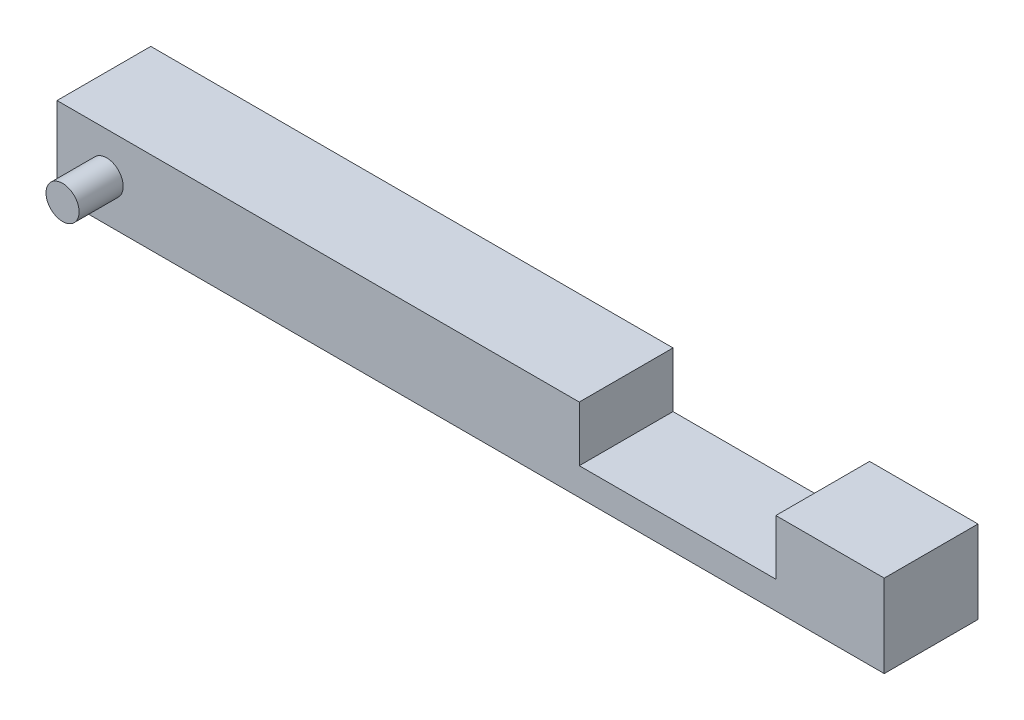
ISO-10303-21;
HEADER;
FILE_DESCRIPTION(('STEP AP214'),'2;1');
FILE_NAME('part.step','',(''),(''),'','','');
FILE_SCHEMA(('AUTOMOTIVE_DESIGN { 1 0 10303 214 1 1 1 1 }'));
ENDSEC;
DATA;
#1=APPLICATION_CONTEXT('core data for automotive mechanical design processes');
#2=APPLICATION_PROTOCOL_DEFINITION('international standard','automotive_design',2000,#1);
#3=PRODUCT_CONTEXT('',#1,'mechanical');
#4=PRODUCT('Part','Part','',(#3));
#5=PRODUCT_RELATED_PRODUCT_CATEGORY('part','',(#4));
#6=PRODUCT_DEFINITION_FORMATION('','',#4);
#7=PRODUCT_DEFINITION_CONTEXT('part definition',#1,'design');
#8=PRODUCT_DEFINITION('design','',#6,#7);
#9=PRODUCT_DEFINITION_SHAPE('','',#8);
#10=(LENGTH_UNIT() NAMED_UNIT(*) SI_UNIT(.MILLI.,.METRE.));
#11=(NAMED_UNIT(*) PLANE_ANGLE_UNIT() SI_UNIT($,.RADIAN.));
#12=(NAMED_UNIT(*) SI_UNIT($,.STERADIAN.) SOLID_ANGLE_UNIT());
#13=UNCERTAINTY_MEASURE_WITH_UNIT(LENGTH_MEASURE(1.E-05),#10,'distance_accuracy_value','');
#14=(GEOMETRIC_REPRESENTATION_CONTEXT(3) GLOBAL_UNCERTAINTY_ASSIGNED_CONTEXT((#13)) GLOBAL_UNIT_ASSIGNED_CONTEXT((#10,
#11,#12)) REPRESENTATION_CONTEXT('',''));
#15=CARTESIAN_POINT('',(0.,0.,0.));
#16=DIRECTION('',(0.,0.,1.));
#17=DIRECTION('',(1.,0.,0.));
#18=AXIS2_PLACEMENT_3D('',#15,#16,#17);
#19=CARTESIAN_POINT('',(-60.5906882591093,-20.3481781376518,17.));
#20=DIRECTION('',(1.,0.,0.));
#21=DIRECTION('',(0.,0.,-1.));
#22=AXIS2_PLACEMENT_3D('',#19,#20,#21);
#23=PLANE('',#22);
#24=DIRECTION('',(0.,-1.,0.));
#25=VECTOR('',#24,1.);
#26=CARTESIAN_POINT('',(-60.5906882591093,-20.3481781376518,0.));
#27=LINE('',#26,#25);
#28=CARTESIAN_POINT('',(-60.5906882591093,-5.34817813765183,0.));
#29=VERTEX_POINT('',#28);
#30=CARTESIAN_POINT('',(-60.5906882591093,-20.3481781376518,0.));
#31=VERTEX_POINT('',#30);
#32=EDGE_CURVE('E147',#29,#31,#27,.T.);
#33=ORIENTED_EDGE('',*,*,#32,.T.);
#34=DIRECTION('',(0.,0.,-1.));
#35=VECTOR('',#34,1.);
#36=CARTESIAN_POINT('',(-60.5906882591093,-20.3481781376518,17.));
#37=LINE('',#36,#35);
#38=CARTESIAN_POINT('',(-60.5906882591093,-20.3481781376518,17.));
#39=VERTEX_POINT('',#38);
#40=EDGE_CURVE('E54',#39,#31,#37,.T.);
#41=ORIENTED_EDGE('',*,*,#40,.F.);
#42=DIRECTION('',(0.,-1.,0.));
#43=VECTOR('',#42,1.);
#44=CARTESIAN_POINT('',(-60.5906882591093,-20.3481781376518,17.));
#45=LINE('',#44,#43);
#46=CARTESIAN_POINT('',(-60.5906882591093,-5.34817813765183,17.));
#47=VERTEX_POINT('',#46);
#48=EDGE_CURVE('E170',#47,#39,#45,.T.);
#49=ORIENTED_EDGE('',*,*,#48,.F.);
#50=DIRECTION('',(0.,0.,-1.));
#51=VECTOR('',#50,1.);
#52=CARTESIAN_POINT('',(-60.5906882591093,-5.34817813765183,17.));
#53=LINE('',#52,#51);
#54=EDGE_CURVE('E143',#47,#29,#53,.T.);
#55=ORIENTED_EDGE('',*,*,#54,.T.);
#56=EDGE_LOOP('',(#33,#41,#49,#55));
#57=FACE_BOUND('',#56,.T.);
#58=ADVANCED_FACE('F45',(#57),#23,.F.);
#59=CARTESIAN_POINT('',(-60.5906882591093,-20.3481781376518,17.));
#60=DIRECTION('',(0.,1.,0.));
#61=DIRECTION('',(0.,0.,1.));
#62=AXIS2_PLACEMENT_3D('',#59,#60,#61);
#63=PLANE('',#62);
#64=DIRECTION('',(1.,0.,0.));
#65=VECTOR('',#64,1.);
#66=CARTESIAN_POINT('',(-60.5906882591093,-20.3481781376518,0.));
#67=LINE('',#66,#65);
#68=CARTESIAN_POINT('',(89.4093117408907,-20.3481781376518,0.));
#69=VERTEX_POINT('',#68);
#70=EDGE_CURVE('E151',#31,#69,#67,.T.);
#71=ORIENTED_EDGE('',*,*,#70,.T.);
#72=DIRECTION('',(0.,0.,-1.));
#73=VECTOR('',#72,1.);
#74=CARTESIAN_POINT('',(89.4093117408907,-20.3481781376518,17.));
#75=LINE('',#74,#73);
#76=CARTESIAN_POINT('',(89.4093117408907,-20.3481781376518,17.));
#77=VERTEX_POINT('',#76);
#78=EDGE_CURVE('E185',#77,#69,#75,.T.);
#79=ORIENTED_EDGE('',*,*,#78,.F.);
#80=DIRECTION('',(1.,0.,0.));
#81=VECTOR('',#80,1.);
#82=CARTESIAN_POINT('',(-60.5906882591093,-20.3481781376518,17.));
#83=LINE('',#82,#81);
#84=EDGE_CURVE('E106',#39,#77,#83,.T.);
#85=ORIENTED_EDGE('',*,*,#84,.F.);
#86=ORIENTED_EDGE('',*,*,#40,.T.);
#87=EDGE_LOOP('',(#71,#79,#85,#86));
#88=FACE_BOUND('',#87,.T.);
#89=ADVANCED_FACE('F190',(#88),#63,.F.);
#90=CARTESIAN_POINT('',(89.4093117408907,-5.34817813765182,17.));
#91=DIRECTION('',(-1.,0.,0.));
#92=DIRECTION('',(0.,0.,1.));
#93=AXIS2_PLACEMENT_3D('',#90,#91,#92);
#94=PLANE('',#93);
#95=DIRECTION('',(0.,1.,0.));
#96=VECTOR('',#95,1.);
#97=CARTESIAN_POINT('',(89.4093117408907,-5.34817813765182,0.));
#98=LINE('',#97,#96);
#99=CARTESIAN_POINT('',(89.4093117408907,-5.34817813765182,0.));
#100=VERTEX_POINT('',#99);
#101=EDGE_CURVE('E155',#69,#100,#98,.T.);
#102=ORIENTED_EDGE('',*,*,#101,.T.);
#103=DIRECTION('',(0.,0.,-1.));
#104=VECTOR('',#103,1.);
#105=CARTESIAN_POINT('',(89.4093117408907,-5.34817813765182,17.));
#106=LINE('',#105,#104);
#107=CARTESIAN_POINT('',(89.4093117408907,-5.34817813765182,17.));
#108=VERTEX_POINT('',#107);
#109=EDGE_CURVE('E181',#108,#100,#106,.T.);
#110=ORIENTED_EDGE('',*,*,#109,.F.);
#111=DIRECTION('',(0.,1.,0.));
#112=VECTOR('',#111,1.);
#113=CARTESIAN_POINT('',(89.4093117408907,-5.34817813765182,17.));
#114=LINE('',#113,#112);
#115=EDGE_CURVE('E209',#77,#108,#114,.T.);
#116=ORIENTED_EDGE('',*,*,#115,.F.);
#117=ORIENTED_EDGE('',*,*,#78,.T.);
#118=EDGE_LOOP('',(#102,#110,#116,#117));
#119=FACE_BOUND('',#118,.T.);
#120=ADVANCED_FACE('F201',(#119),#94,.F.);
#121=CARTESIAN_POINT('',(69.7493117408907,-5.34817813765182,17.));
#122=DIRECTION('',(0.,-1.,0.));
#123=DIRECTION('',(1.,0.,0.));
#124=AXIS2_PLACEMENT_3D('',#121,#122,#123);
#125=PLANE('',#124);
#126=DIRECTION('',(-1.,0.,0.));
#127=VECTOR('',#126,1.);
#128=CARTESIAN_POINT('',(69.7493117408907,-5.34817813765182,0.));
#129=LINE('',#128,#127);
#130=CARTESIAN_POINT('',(69.7493117408907,-5.34817813765182,0.));
#131=VERTEX_POINT('',#130);
#132=EDGE_CURVE('E158',#100,#131,#129,.T.);
#133=ORIENTED_EDGE('',*,*,#132,.T.);
#134=DIRECTION('',(0.,0.,-1.));
#135=VECTOR('',#134,1.);
#136=CARTESIAN_POINT('',(69.7493117408907,-5.34817813765182,17.));
#137=LINE('',#136,#135);
#138=CARTESIAN_POINT('',(69.7493117408907,-5.34817813765182,17.));
#139=VERTEX_POINT('',#138);
#140=EDGE_CURVE('E177',#139,#131,#137,.T.);
#141=ORIENTED_EDGE('',*,*,#140,.F.);
#142=DIRECTION('',(-1.,0.,0.));
#143=VECTOR('',#142,1.);
#144=CARTESIAN_POINT('',(69.7493117408907,-5.34817813765182,17.));
#145=LINE('',#144,#143);
#146=EDGE_CURVE('E207',#108,#139,#145,.T.);
#147=ORIENTED_EDGE('',*,*,#146,.F.);
#148=ORIENTED_EDGE('',*,*,#109,.T.);
#149=EDGE_LOOP('',(#133,#141,#147,#148));
#150=FACE_BOUND('',#149,.T.);
#151=ADVANCED_FACE('F205',(#150),#125,.F.);
#152=CARTESIAN_POINT('',(69.7493117408907,-15.3481781376518,17.));
#153=DIRECTION('',(1.,0.,0.));
#154=DIRECTION('',(0.,0.,-1.));
#155=AXIS2_PLACEMENT_3D('',#152,#153,#154);
#156=PLANE('',#155);
#157=DIRECTION('',(0.,-1.,0.));
#158=VECTOR('',#157,1.);
#159=CARTESIAN_POINT('',(69.7493117408907,-15.3481781376518,0.));
#160=LINE('',#159,#158);
#161=CARTESIAN_POINT('',(69.7493117408907,-15.3481781376518,0.));
#162=VERTEX_POINT('',#161);
#163=EDGE_CURVE('E161',#131,#162,#160,.T.);
#164=ORIENTED_EDGE('',*,*,#163,.T.);
#165=DIRECTION('',(0.,0.,-1.));
#166=VECTOR('',#165,1.);
#167=CARTESIAN_POINT('',(69.7493117408907,-15.3481781376518,17.));
#168=LINE('',#167,#166);
#169=CARTESIAN_POINT('',(69.7493117408907,-15.3481781376518,17.));
#170=VERTEX_POINT('',#169);
#171=EDGE_CURVE('E136',#170,#162,#168,.T.);
#172=ORIENTED_EDGE('',*,*,#171,.F.);
#173=DIRECTION('',(0.,-1.,0.));
#174=VECTOR('',#173,1.);
#175=CARTESIAN_POINT('',(69.7493117408907,-15.3481781376518,17.));
#176=LINE('',#175,#174);
#177=EDGE_CURVE('E125',#139,#170,#176,.T.);
#178=ORIENTED_EDGE('',*,*,#177,.F.);
#179=ORIENTED_EDGE('',*,*,#140,.T.);
#180=EDGE_LOOP('',(#164,#172,#178,#179));
#181=FACE_BOUND('',#180,.T.);
#182=ADVANCED_FACE('F272',(#181),#156,.F.);
#183=CARTESIAN_POINT('',(34.1093117408907,-15.3481781376518,17.));
#184=DIRECTION('',(0.,-1.,0.));
#185=DIRECTION('',(1.,0.,0.));
#186=AXIS2_PLACEMENT_3D('',#183,#184,#185);
#187=PLANE('',#186);
#188=DIRECTION('',(-1.,0.,0.));
#189=VECTOR('',#188,1.);
#190=CARTESIAN_POINT('',(34.1093117408907,-15.3481781376518,0.));
#191=LINE('',#190,#189);
#192=CARTESIAN_POINT('',(34.1093117408907,-15.3481781376518,0.));
#193=VERTEX_POINT('',#192);
#194=EDGE_CURVE('E134',#162,#193,#191,.T.);
#195=ORIENTED_EDGE('',*,*,#194,.T.);
#196=DIRECTION('',(0.,0.,-1.));
#197=VECTOR('',#196,1.);
#198=CARTESIAN_POINT('',(34.1093117408907,-15.3481781376518,17.));
#199=LINE('',#198,#197);
#200=CARTESIAN_POINT('',(34.1093117408907,-15.3481781376518,17.));
#201=VERTEX_POINT('',#200);
#202=EDGE_CURVE('E131',#201,#193,#199,.T.);
#203=ORIENTED_EDGE('',*,*,#202,.F.);
#204=DIRECTION('',(-1.,0.,0.));
#205=VECTOR('',#204,1.);
#206=CARTESIAN_POINT('',(34.1093117408907,-15.3481781376518,17.));
#207=LINE('',#206,#205);
#208=EDGE_CURVE('E119',#170,#201,#207,.T.);
#209=ORIENTED_EDGE('',*,*,#208,.F.);
#210=ORIENTED_EDGE('',*,*,#171,.T.);
#211=EDGE_LOOP('',(#195,#203,#209,#210));
#212=FACE_BOUND('',#211,.T.);
#213=ADVANCED_FACE('F132',(#212),#187,.F.);
#214=CARTESIAN_POINT('',(34.1093117408907,-5.34817813765183,17.));
#215=DIRECTION('',(-1.,0.,0.));
#216=DIRECTION('',(0.,0.,1.));
#217=AXIS2_PLACEMENT_3D('',#214,#215,#216);
#218=PLANE('',#217);
#219=DIRECTION('',(0.,1.,0.));
#220=VECTOR('',#219,1.);
#221=CARTESIAN_POINT('',(34.1093117408907,-5.34817813765183,0.));
#222=LINE('',#221,#220);
#223=CARTESIAN_POINT('',(34.1093117408907,-5.34817813765183,0.));
#224=VERTEX_POINT('',#223);
#225=EDGE_CURVE('E91',#193,#224,#222,.T.);
#226=ORIENTED_EDGE('',*,*,#225,.T.);
#227=DIRECTION('',(0.,0.,-1.));
#228=VECTOR('',#227,1.);
#229=CARTESIAN_POINT('',(34.1093117408907,-5.34817813765183,17.));
#230=LINE('',#229,#228);
#231=CARTESIAN_POINT('',(34.1093117408907,-5.34817813765183,17.));
#232=VERTEX_POINT('',#231);
#233=EDGE_CURVE('E137',#232,#224,#230,.T.);
#234=ORIENTED_EDGE('',*,*,#233,.F.);
#235=DIRECTION('',(0.,1.,0.));
#236=VECTOR('',#235,1.);
#237=CARTESIAN_POINT('',(34.1093117408907,-5.34817813765183,17.));
#238=LINE('',#237,#236);
#239=EDGE_CURVE('E123',#201,#232,#238,.T.);
#240=ORIENTED_EDGE('',*,*,#239,.F.);
#241=ORIENTED_EDGE('',*,*,#202,.T.);
#242=EDGE_LOOP('',(#226,#234,#240,#241));
#243=FACE_BOUND('',#242,.T.);
#244=ADVANCED_FACE('F139',(#243),#218,.F.);
#245=CARTESIAN_POINT('',(-60.5906882591093,-5.34817813765183,17.));
#246=DIRECTION('',(0.,-1.,0.));
#247=DIRECTION('',(0.,0.,-1.));
#248=AXIS2_PLACEMENT_3D('',#245,#246,#247);
#249=PLANE('',#248);
#250=DIRECTION('',(-1.,0.,0.));
#251=VECTOR('',#250,1.);
#252=CARTESIAN_POINT('',(-60.5906882591093,-5.34817813765183,0.));
#253=LINE('',#252,#251);
#254=EDGE_CURVE('E97',#224,#29,#253,.T.);
#255=ORIENTED_EDGE('',*,*,#254,.T.);
#256=ORIENTED_EDGE('',*,*,#54,.F.);
#257=DIRECTION('',(-1.,0.,0.));
#258=VECTOR('',#257,1.);
#259=CARTESIAN_POINT('',(-60.5906882591093,-5.34817813765183,17.));
#260=LINE('',#259,#258);
#261=EDGE_CURVE('E62',#232,#47,#260,.T.);
#262=ORIENTED_EDGE('',*,*,#261,.F.);
#263=ORIENTED_EDGE('',*,*,#233,.T.);
#264=EDGE_LOOP('',(#255,#256,#262,#263));
#265=FACE_BOUND('',#264,.T.);
#266=ADVANCED_FACE('F249',(#265),#249,.F.);
#267=CARTESIAN_POINT('',(0.,0.,17.));
#268=DIRECTION('',(0.,0.,-1.));
#269=DIRECTION('',(-1.,0.,0.));
#270=AXIS2_PLACEMENT_3D('',#267,#268,#269);
#271=PLANE('',#270);
#272=CARTESIAN_POINT('',(-51.5906882591093,-12.8481781376518,17.));
#273=DIRECTION('',(0.,0.,-1.));
#274=DIRECTION('',(-1.,0.,0.));
#275=AXIS2_PLACEMENT_3D('',#272,#273,#274);
#276=CIRCLE('',#275,3.);
#277=CARTESIAN_POINT('',(-54.5906882591093,-12.8481781376518,17.));
#278=VERTEX_POINT('',#277);
#279=EDGE_CURVE('E11',#278,#278,#276,.F.);
#280=ORIENTED_EDGE('',*,*,#279,.F.);
#281=EDGE_LOOP('',(#280));
#282=FACE_BOUND('',#281,.T.);
#283=ORIENTED_EDGE('',*,*,#48,.T.);
#284=ORIENTED_EDGE('',*,*,#84,.T.);
#285=ORIENTED_EDGE('',*,*,#115,.T.);
#286=ORIENTED_EDGE('',*,*,#146,.T.);
#287=ORIENTED_EDGE('',*,*,#177,.T.);
#288=ORIENTED_EDGE('',*,*,#208,.T.);
#289=ORIENTED_EDGE('',*,*,#239,.T.);
#290=ORIENTED_EDGE('',*,*,#261,.T.);
#291=EDGE_LOOP('',(#283,#284,#285,#286,#287,#288,#289,#290));
#292=FACE_BOUND('',#291,.T.);
#293=ADVANCED_FACE('F121',(#282,#292),#271,.F.);
#294=CARTESIAN_POINT('',(0.,0.,0.));
#295=DIRECTION('',(0.,0.,-1.));
#296=DIRECTION('',(-1.,0.,0.));
#297=AXIS2_PLACEMENT_3D('',#294,#295,#296);
#298=PLANE('',#297);
#299=CARTESIAN_POINT('',(14.4093117408907,-12.8481781376518,0.));
#300=DIRECTION('',(0.,0.,-1.));
#301=DIRECTION('',(-1.,0.,0.));
#302=AXIS2_PLACEMENT_3D('',#299,#300,#301);
#303=CIRCLE('',#302,3.25);
#304=CARTESIAN_POINT('',(11.1593117408907,-12.8481781376518,0.));
#305=VERTEX_POINT('',#304);
#306=EDGE_CURVE('E228',#305,#305,#303,.T.);
#307=ORIENTED_EDGE('',*,*,#306,.F.);
#308=EDGE_LOOP('',(#307));
#309=FACE_BOUND('',#308,.T.);
#310=CARTESIAN_POINT('',(-51.5906882591093,-12.8481781376518,0.));
#311=DIRECTION('',(0.,0.,-1.));
#312=DIRECTION('',(-1.,0.,0.));
#313=AXIS2_PLACEMENT_3D('',#310,#311,#312);
#314=CIRCLE('',#313,3.25);
#315=CARTESIAN_POINT('',(-54.8406882591093,-12.8481781376518,0.));
#316=VERTEX_POINT('',#315);
#317=EDGE_CURVE('E223',#316,#316,#314,.T.);
#318=ORIENTED_EDGE('',*,*,#317,.F.);
#319=EDGE_LOOP('',(#318));
#320=FACE_BOUND('',#319,.T.);
#321=ORIENTED_EDGE('',*,*,#32,.F.);
#322=ORIENTED_EDGE('',*,*,#254,.F.);
#323=ORIENTED_EDGE('',*,*,#225,.F.);
#324=ORIENTED_EDGE('',*,*,#194,.F.);
#325=ORIENTED_EDGE('',*,*,#163,.F.);
#326=ORIENTED_EDGE('',*,*,#132,.F.);
#327=ORIENTED_EDGE('',*,*,#101,.F.);
#328=ORIENTED_EDGE('',*,*,#70,.F.);
#329=EDGE_LOOP('',(#321,#322,#323,#324,#325,#326,#327,#328));
#330=FACE_BOUND('',#329,.T.);
#331=ADVANCED_FACE('F195',(#309,#320,#330),#298,.T.);
#332=CARTESIAN_POINT('',(-51.5906882591093,-12.8481781376518,6.));
#333=DIRECTION('',(0.,0.,-1.));
#334=DIRECTION('',(-1.,0.,0.));
#335=AXIS2_PLACEMENT_3D('',#332,#333,#334);
#336=CYLINDRICAL_SURFACE('',#335,3.25);
#337=CARTESIAN_POINT('',(-51.5906882591093,-12.8481781376518,6.));
#338=DIRECTION('',(0.,0.,-1.));
#339=DIRECTION('',(-1.,0.,0.));
#340=AXIS2_PLACEMENT_3D('',#337,#338,#339);
#341=CIRCLE('',#340,3.25);
#342=CARTESIAN_POINT('',(-54.8406882591093,-12.8481781376518,6.));
#343=VERTEX_POINT('',#342);
#344=EDGE_CURVE('E219',#343,#343,#341,.T.);
#345=ORIENTED_EDGE('',*,*,#344,.F.);
#346=EDGE_LOOP('',(#345));
#347=FACE_BOUND('',#346,.T.);
#348=ORIENTED_EDGE('',*,*,#317,.T.);
#349=EDGE_LOOP('',(#348));
#350=FACE_BOUND('',#349,.T.);
#351=ADVANCED_FACE('F255',(#347,#350),#336,.F.);
#352=CARTESIAN_POINT('',(-51.5906882591093,-12.8481781376518,6.));
#353=DIRECTION('',(0.,0.,-1.));
#354=DIRECTION('',(-1.,0.,0.));
#355=AXIS2_PLACEMENT_3D('',#352,#353,#354);
#356=PLANE('',#355);
#357=ORIENTED_EDGE('',*,*,#344,.T.);
#358=EDGE_LOOP('',(#357));
#359=FACE_BOUND('',#358,.T.);
#360=ADVANCED_FACE('F300',(#359),#356,.T.);
#361=CARTESIAN_POINT('',(14.4093117408907,-12.8481781376518,6.));
#362=DIRECTION('',(0.,0.,-1.));
#363=DIRECTION('',(-1.,0.,0.));
#364=AXIS2_PLACEMENT_3D('',#361,#362,#363);
#365=CYLINDRICAL_SURFACE('',#364,3.25);
#366=CARTESIAN_POINT('',(14.4093117408907,-12.8481781376518,6.));
#367=DIRECTION('',(0.,0.,-1.));
#368=DIRECTION('',(-1.,0.,0.));
#369=AXIS2_PLACEMENT_3D('',#366,#367,#368);
#370=CIRCLE('',#369,3.25);
#371=CARTESIAN_POINT('',(11.1593117408907,-12.8481781376518,6.));
#372=VERTEX_POINT('',#371);
#373=EDGE_CURVE('E152',#372,#372,#370,.T.);
#374=ORIENTED_EDGE('',*,*,#373,.F.);
#375=EDGE_LOOP('',(#374));
#376=FACE_BOUND('',#375,.T.);
#377=ORIENTED_EDGE('',*,*,#306,.T.);
#378=EDGE_LOOP('',(#377));
#379=FACE_BOUND('',#378,.T.);
#380=ADVANCED_FACE('F309',(#376,#379),#365,.F.);
#381=CARTESIAN_POINT('',(14.4093117408907,-12.8481781376518,6.));
#382=DIRECTION('',(0.,0.,-1.));
#383=DIRECTION('',(-1.,0.,0.));
#384=AXIS2_PLACEMENT_3D('',#381,#382,#383);
#385=PLANE('',#384);
#386=ORIENTED_EDGE('',*,*,#373,.T.);
#387=EDGE_LOOP('',(#386));
#388=FACE_BOUND('',#387,.T.);
#389=ADVANCED_FACE('F244',(#388),#385,.T.);
#390=CARTESIAN_POINT('',(-51.5906882591093,-12.8481781376518,25.));
#391=DIRECTION('',(0.,0.,-1.));
#392=DIRECTION('',(-1.,0.,0.));
#393=AXIS2_PLACEMENT_3D('',#390,#391,#392);
#394=CYLINDRICAL_SURFACE('',#393,3.);
#395=CARTESIAN_POINT('',(-51.5906882591093,-12.8481781376518,25.));
#396=DIRECTION('',(0.,0.,1.));
#397=DIRECTION('',(1.,0.,0.));
#398=AXIS2_PLACEMENT_3D('',#395,#396,#397);
#399=CIRCLE('',#398,3.);
#400=CARTESIAN_POINT('',(-48.5906882591093,-12.8481781376518,25.));
#401=VERTEX_POINT('',#400);
#402=EDGE_CURVE('E224',#401,#401,#399,.T.);
#403=ORIENTED_EDGE('',*,*,#402,.F.);
#404=EDGE_LOOP('',(#403));
#405=FACE_BOUND('',#404,.T.);
#406=ORIENTED_EDGE('',*,*,#279,.T.);
#407=EDGE_LOOP('',(#406));
#408=FACE_BOUND('',#407,.T.);
#409=ADVANCED_FACE('F241',(#405,#408),#394,.T.);
#410=CARTESIAN_POINT('',(-51.5906882591093,-12.8481781376518,25.));
#411=DIRECTION('',(0.,0.,1.));
#412=DIRECTION('',(1.,0.,0.));
#413=AXIS2_PLACEMENT_3D('',#410,#411,#412);
#414=PLANE('',#413);
#415=ORIENTED_EDGE('',*,*,#402,.T.);
#416=EDGE_LOOP('',(#415));
#417=FACE_BOUND('',#416,.T.);
#418=ADVANCED_FACE('F239',(#417),#414,.T.);
#419=CLOSED_SHELL('',(#58,#89,#120,#151,#182,#213,#244,#266,#293,#331,#351,#360,#380,#389,#409,#418));
#420=MANIFOLD_SOLID_BREP('B2',#419);
#421=ADVANCED_BREP_SHAPE_REPRESENTATION('',(#18,#420),#14);
#422=SHAPE_DEFINITION_REPRESENTATION(#9,#421);
ENDSEC;
END-ISO-10303-21;
